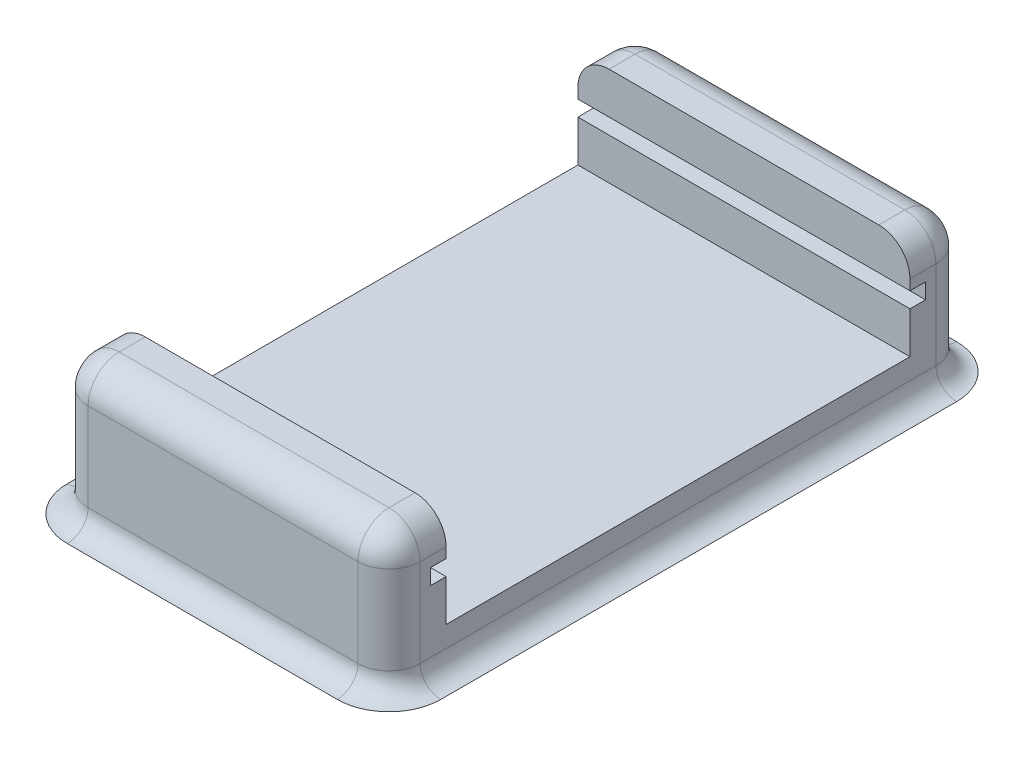
ISO-10303-21;
HEADER;
FILE_DESCRIPTION(('STEP AP214'),'2;1');
FILE_NAME('part.step','',(''),(''),'','','');
FILE_SCHEMA(('AUTOMOTIVE_DESIGN { 1 0 10303 214 1 1 1 1 }'));
ENDSEC;
DATA;
#1=APPLICATION_CONTEXT('core data for automotive mechanical design processes');
#2=APPLICATION_PROTOCOL_DEFINITION('international standard','automotive_design',2000,#1);
#3=PRODUCT_CONTEXT('',#1,'mechanical');
#4=PRODUCT('Part','Part','',(#3));
#5=PRODUCT_RELATED_PRODUCT_CATEGORY('part','',(#4));
#6=PRODUCT_DEFINITION_FORMATION('','',#4);
#7=PRODUCT_DEFINITION_CONTEXT('part definition',#1,'design');
#8=PRODUCT_DEFINITION('design','',#6,#7);
#9=PRODUCT_DEFINITION_SHAPE('','',#8);
#10=(LENGTH_UNIT() NAMED_UNIT(*) SI_UNIT(.MILLI.,.METRE.));
#11=(NAMED_UNIT(*) PLANE_ANGLE_UNIT() SI_UNIT($,.RADIAN.));
#12=(NAMED_UNIT(*) SI_UNIT($,.STERADIAN.) SOLID_ANGLE_UNIT());
#13=UNCERTAINTY_MEASURE_WITH_UNIT(LENGTH_MEASURE(1.E-05),#10,'distance_accuracy_value','');
#14=(GEOMETRIC_REPRESENTATION_CONTEXT(3) GLOBAL_UNCERTAINTY_ASSIGNED_CONTEXT((#13)) GLOBAL_UNIT_ASSIGNED_CONTEXT((#10,
#11,#12)) REPRESENTATION_CONTEXT('',''));
#15=CARTESIAN_POINT('',(0.,0.,0.));
#16=DIRECTION('',(0.,0.,1.));
#17=DIRECTION('',(1.,0.,0.));
#18=AXIS2_PLACEMENT_3D('',#15,#16,#17);
#19=CARTESIAN_POINT('',(24.13,18.0594,0.));
#20=DIRECTION('',(0.,1.,0.));
#21=DIRECTION('',(0.,0.,1.));
#22=AXIS2_PLACEMENT_3D('',#19,#20,#21);
#23=PLANE('',#22);
#24=DIRECTION('',(0.,0.,1.));
#25=VECTOR('',#24,1.);
#26=CARTESIAN_POINT('',(64.77,18.0594,0.));
#27=LINE('',#26,#25);
#28=CARTESIAN_POINT('',(64.77,18.0594,-86.106));
#29=VERTEX_POINT('',#28);
#30=CARTESIAN_POINT('',(64.77,18.0594,-84.201));
#31=VERTEX_POINT('',#30);
#32=EDGE_CURVE('E384',#29,#31,#27,.T.);
#33=ORIENTED_EDGE('',*,*,#32,.T.);
#34=DIRECTION('',(1.,0.,0.));
#35=VECTOR('',#34,1.);
#36=CARTESIAN_POINT('',(24.13,18.0594,-84.201));
#37=LINE('',#36,#35);
#38=CARTESIAN_POINT('',(24.13,18.0594,-84.201));
#39=VERTEX_POINT('',#38);
#40=EDGE_CURVE('E331',#39,#31,#37,.T.);
#41=ORIENTED_EDGE('',*,*,#40,.F.);
#42=DIRECTION('',(0.,0.,1.));
#43=VECTOR('',#42,1.);
#44=CARTESIAN_POINT('',(24.13,18.0594,0.));
#45=LINE('',#44,#43);
#46=CARTESIAN_POINT('',(24.13,18.0594,-86.106));
#47=VERTEX_POINT('',#46);
#48=EDGE_CURVE('E50',#47,#39,#45,.T.);
#49=ORIENTED_EDGE('',*,*,#48,.F.);
#50=DIRECTION('',(1.,0.,0.));
#51=VECTOR('',#50,1.);
#52=CARTESIAN_POINT('',(24.13,18.0594,-86.106));
#53=LINE('',#52,#51);
#54=EDGE_CURVE('E380',#47,#29,#53,.T.);
#55=ORIENTED_EDGE('',*,*,#54,.T.);
#56=EDGE_LOOP('',(#33,#41,#49,#55));
#57=FACE_BOUND('',#56,.T.);
#58=ADVANCED_FACE('F46',(#57),#23,.F.);
#59=CARTESIAN_POINT('',(24.13,0.,-84.201));
#60=DIRECTION('',(0.,0.,1.));
#61=DIRECTION('',(1.,0.,0.));
#62=AXIS2_PLACEMENT_3D('',#59,#60,#61);
#63=PLANE('',#62);
#64=DIRECTION('',(0.,-1.,0.));
#65=VECTOR('',#64,1.);
#66=CARTESIAN_POINT('',(64.77,0.,-84.201));
#67=LINE('',#66,#65);
#68=CARTESIAN_POINT('',(64.77,16.1544,-84.201));
#69=VERTEX_POINT('',#68);
#70=EDGE_CURVE('E336',#31,#69,#67,.T.);
#71=ORIENTED_EDGE('',*,*,#70,.T.);
#72=DIRECTION('',(1.,0.,0.));
#73=VECTOR('',#72,1.);
#74=CARTESIAN_POINT('',(24.13,16.1544,-84.201));
#75=LINE('',#74,#73);
#76=CARTESIAN_POINT('',(24.13,16.1544,-84.201));
#77=VERTEX_POINT('',#76);
#78=EDGE_CURVE('E337',#77,#69,#75,.T.);
#79=ORIENTED_EDGE('',*,*,#78,.F.);
#80=DIRECTION('',(0.,-1.,0.));
#81=VECTOR('',#80,1.);
#82=CARTESIAN_POINT('',(24.13,0.,-84.201));
#83=LINE('',#82,#81);
#84=EDGE_CURVE('E424',#39,#77,#83,.T.);
#85=ORIENTED_EDGE('',*,*,#84,.F.);
#86=ORIENTED_EDGE('',*,*,#40,.T.);
#87=EDGE_LOOP('',(#71,#79,#85,#86));
#88=FACE_BOUND('',#87,.T.);
#89=ADVANCED_FACE('F516',(#88),#63,.F.);
#90=CARTESIAN_POINT('',(24.13,16.1544,0.));
#91=DIRECTION('',(0.,1.,0.));
#92=DIRECTION('',(0.,0.,1.));
#93=AXIS2_PLACEMENT_3D('',#90,#91,#92);
#94=PLANE('',#93);
#95=DIRECTION('',(0.,0.,1.));
#96=VECTOR('',#95,1.);
#97=CARTESIAN_POINT('',(64.77,16.1544,0.));
#98=LINE('',#97,#96);
#99=CARTESIAN_POINT('',(64.77,16.1544,-86.106));
#100=VERTEX_POINT('',#99);
#101=EDGE_CURVE('E266',#100,#69,#98,.T.);
#102=ORIENTED_EDGE('',*,*,#101,.F.);
#103=DIRECTION('',(1.,0.,0.));
#104=VECTOR('',#103,1.);
#105=CARTESIAN_POINT('',(24.13,16.1544,-86.106));
#106=LINE('',#105,#104);
#107=CARTESIAN_POINT('',(24.13,16.1544,-86.106));
#108=VERTEX_POINT('',#107);
#109=EDGE_CURVE('E342',#108,#100,#106,.T.);
#110=ORIENTED_EDGE('',*,*,#109,.F.);
#111=DIRECTION('',(0.,0.,1.));
#112=VECTOR('',#111,1.);
#113=CARTESIAN_POINT('',(24.13,16.1544,0.));
#114=LINE('',#113,#112);
#115=EDGE_CURVE('E335',#108,#77,#114,.T.);
#116=ORIENTED_EDGE('',*,*,#115,.T.);
#117=ORIENTED_EDGE('',*,*,#78,.T.);
#118=EDGE_LOOP('',(#102,#110,#116,#117));
#119=FACE_BOUND('',#118,.T.);
#120=ADVANCED_FACE('F517',(#119),#94,.T.);
#121=CARTESIAN_POINT('',(24.13,0.,-86.106));
#122=DIRECTION('',(0.,0.,1.));
#123=DIRECTION('',(1.,0.,0.));
#124=AXIS2_PLACEMENT_3D('',#121,#122,#123);
#125=PLANE('',#124);
#126=DIRECTION('',(0.,-1.,0.));
#127=VECTOR('',#126,1.);
#128=CARTESIAN_POINT('',(64.77,0.,-86.106));
#129=LINE('',#128,#127);
#130=CARTESIAN_POINT('',(64.77,11.0744,-86.106));
#131=VERTEX_POINT('',#130);
#132=EDGE_CURVE('E341',#100,#131,#129,.T.);
#133=ORIENTED_EDGE('',*,*,#132,.T.);
#134=DIRECTION('',(1.,0.,0.));
#135=VECTOR('',#134,1.);
#136=CARTESIAN_POINT('',(24.13,11.0744,-86.106));
#137=LINE('',#136,#135);
#138=CARTESIAN_POINT('',(24.13,11.0744,-86.106));
#139=VERTEX_POINT('',#138);
#140=EDGE_CURVE('E347',#139,#131,#137,.T.);
#141=ORIENTED_EDGE('',*,*,#140,.F.);
#142=DIRECTION('',(0.,-1.,0.));
#143=VECTOR('',#142,1.);
#144=CARTESIAN_POINT('',(24.13,0.,-86.106));
#145=LINE('',#144,#143);
#146=EDGE_CURVE('E420',#108,#139,#145,.T.);
#147=ORIENTED_EDGE('',*,*,#146,.F.);
#148=ORIENTED_EDGE('',*,*,#109,.T.);
#149=EDGE_LOOP('',(#133,#141,#147,#148));
#150=FACE_BOUND('',#149,.T.);
#151=ADVANCED_FACE('F522',(#150),#125,.F.);
#152=CARTESIAN_POINT('',(24.13,11.0744,0.));
#153=DIRECTION('',(0.,1.,0.));
#154=DIRECTION('',(0.,0.,1.));
#155=AXIS2_PLACEMENT_3D('',#152,#153,#154);
#156=PLANE('',#155);
#157=DIRECTION('',(0.,0.,1.));
#158=VECTOR('',#157,1.);
#159=CARTESIAN_POINT('',(64.77,11.0744,0.));
#160=LINE('',#159,#158);
#161=CARTESIAN_POINT('',(64.77,11.0744,-142.875));
#162=VERTEX_POINT('',#161);
#163=EDGE_CURVE('E394',#162,#131,#160,.T.);
#164=ORIENTED_EDGE('',*,*,#163,.F.);
#165=DIRECTION('',(1.,0.,0.));
#166=VECTOR('',#165,1.);
#167=CARTESIAN_POINT('',(24.13,11.0744,-142.875));
#168=LINE('',#167,#166);
#169=CARTESIAN_POINT('',(24.13,11.0744,-142.875));
#170=VERTEX_POINT('',#169);
#171=EDGE_CURVE('E352',#170,#162,#168,.T.);
#172=ORIENTED_EDGE('',*,*,#171,.F.);
#173=DIRECTION('',(0.,0.,1.));
#174=VECTOR('',#173,1.);
#175=CARTESIAN_POINT('',(24.13,11.0744,0.));
#176=LINE('',#175,#174);
#177=EDGE_CURVE('E346',#170,#139,#176,.T.);
#178=ORIENTED_EDGE('',*,*,#177,.T.);
#179=ORIENTED_EDGE('',*,*,#140,.T.);
#180=EDGE_LOOP('',(#164,#172,#178,#179));
#181=FACE_BOUND('',#180,.T.);
#182=ADVANCED_FACE('F526',(#181),#156,.T.);
#183=CARTESIAN_POINT('',(24.13,0.,-142.875));
#184=DIRECTION('',(0.,0.,1.));
#185=DIRECTION('',(1.,0.,0.));
#186=AXIS2_PLACEMENT_3D('',#183,#184,#185);
#187=PLANE('',#186);
#188=DIRECTION('',(0.,-1.,0.));
#189=VECTOR('',#188,1.);
#190=CARTESIAN_POINT('',(64.77,0.,-142.875));
#191=LINE('',#190,#189);
#192=CARTESIAN_POINT('',(64.77,16.1544,-142.875));
#193=VERTEX_POINT('',#192);
#194=EDGE_CURVE('E390',#193,#162,#191,.T.);
#195=ORIENTED_EDGE('',*,*,#194,.F.);
#196=DIRECTION('',(1.,0.,0.));
#197=VECTOR('',#196,1.);
#198=CARTESIAN_POINT('',(24.13,16.1544,-142.875));
#199=LINE('',#198,#197);
#200=CARTESIAN_POINT('',(24.13,16.1544,-142.875));
#201=VERTEX_POINT('',#200);
#202=EDGE_CURVE('E357',#201,#193,#199,.T.);
#203=ORIENTED_EDGE('',*,*,#202,.F.);
#204=DIRECTION('',(0.,-1.,0.));
#205=VECTOR('',#204,1.);
#206=CARTESIAN_POINT('',(24.13,0.,-142.875));
#207=LINE('',#206,#205);
#208=EDGE_CURVE('E351',#201,#170,#207,.T.);
#209=ORIENTED_EDGE('',*,*,#208,.T.);
#210=ORIENTED_EDGE('',*,*,#171,.T.);
#211=EDGE_LOOP('',(#195,#203,#209,#210));
#212=FACE_BOUND('',#211,.T.);
#213=ADVANCED_FACE('F529',(#212),#187,.T.);
#214=CARTESIAN_POINT('',(64.77,16.1544,-144.78));
#215=VERTEX_POINT('',#214);
#216=EDGE_CURVE('E389',#215,#193,#98,.T.);
#217=ORIENTED_EDGE('',*,*,#216,.F.);
#218=DIRECTION('',(1.,0.,0.));
#219=VECTOR('',#218,1.);
#220=CARTESIAN_POINT('',(24.13,16.1544,-144.78));
#221=LINE('',#220,#219);
#222=CARTESIAN_POINT('',(24.13,16.1544,-144.78));
#223=VERTEX_POINT('',#222);
#224=EDGE_CURVE('E362',#223,#215,#221,.T.);
#225=ORIENTED_EDGE('',*,*,#224,.F.);
#226=EDGE_CURVE('E356',#223,#201,#114,.T.);
#227=ORIENTED_EDGE('',*,*,#226,.T.);
#228=ORIENTED_EDGE('',*,*,#202,.T.);
#229=EDGE_LOOP('',(#217,#225,#227,#228));
#230=FACE_BOUND('',#229,.T.);
#231=ADVANCED_FACE('F534',(#230),#94,.T.);
#232=CARTESIAN_POINT('',(24.13,0.,-144.78));
#233=DIRECTION('',(0.,0.,1.));
#234=DIRECTION('',(1.,0.,0.));
#235=AXIS2_PLACEMENT_3D('',#232,#233,#234);
#236=PLANE('',#235);
#237=DIRECTION('',(0.,-1.,0.));
#238=VECTOR('',#237,1.);
#239=CARTESIAN_POINT('',(64.77,0.,-144.78));
#240=LINE('',#239,#238);
#241=CARTESIAN_POINT('',(64.77,18.0594,-144.78));
#242=VERTEX_POINT('',#241);
#243=EDGE_CURVE('E385',#242,#215,#240,.T.);
#244=ORIENTED_EDGE('',*,*,#243,.F.);
#245=DIRECTION('',(1.,0.,0.));
#246=VECTOR('',#245,1.);
#247=CARTESIAN_POINT('',(24.13,18.0594,-144.78));
#248=LINE('',#247,#246);
#249=CARTESIAN_POINT('',(24.13,18.0594,-144.78));
#250=VERTEX_POINT('',#249);
#251=EDGE_CURVE('E256',#250,#242,#248,.T.);
#252=ORIENTED_EDGE('',*,*,#251,.F.);
#253=DIRECTION('',(0.,-1.,0.));
#254=VECTOR('',#253,1.);
#255=CARTESIAN_POINT('',(24.13,0.,-144.78));
#256=LINE('',#255,#254);
#257=EDGE_CURVE('E361',#250,#223,#256,.T.);
#258=ORIENTED_EDGE('',*,*,#257,.T.);
#259=ORIENTED_EDGE('',*,*,#224,.T.);
#260=EDGE_LOOP('',(#244,#252,#258,#259));
#261=FACE_BOUND('',#260,.T.);
#262=ADVANCED_FACE('F562',(#261),#236,.T.);
#263=CARTESIAN_POINT('',(64.77,18.0594,-142.875));
#264=VERTEX_POINT('',#263);
#265=EDGE_CURVE('E366',#242,#264,#27,.T.);
#266=ORIENTED_EDGE('',*,*,#265,.T.);
#267=DIRECTION('',(1.,0.,0.));
#268=VECTOR('',#267,1.);
#269=CARTESIAN_POINT('',(24.13,18.0594,-142.875));
#270=LINE('',#269,#268);
#271=CARTESIAN_POINT('',(24.13,18.0594,-142.875));
#272=VERTEX_POINT('',#271);
#273=EDGE_CURVE('E370',#272,#264,#270,.T.);
#274=ORIENTED_EDGE('',*,*,#273,.F.);
#275=EDGE_CURVE('E307',#250,#272,#45,.T.);
#276=ORIENTED_EDGE('',*,*,#275,.F.);
#277=ORIENTED_EDGE('',*,*,#251,.T.);
#278=EDGE_LOOP('',(#266,#274,#276,#277));
#279=FACE_BOUND('',#278,.T.);
#280=ADVANCED_FACE('F457',(#279),#23,.F.);
#281=CARTESIAN_POINT('',(64.77,19.3294,-142.875));
#282=VERTEX_POINT('',#281);
#283=EDGE_CURVE('E275',#282,#264,#191,.T.);
#284=ORIENTED_EDGE('',*,*,#283,.F.);
#285=CARTESIAN_POINT('',(60.96,19.3294,-142.875));
#286=DIRECTION('',(0.,0.,1.));
#287=DIRECTION('',(1.,0.,0.));
#288=AXIS2_PLACEMENT_3D('',#285,#286,#287);
#289=CIRCLE('',#288,3.81);
#290=CARTESIAN_POINT('',(60.96,23.1394,-142.875));
#291=VERTEX_POINT('',#290);
#292=EDGE_CURVE('E251',#282,#291,#289,.T.);
#293=ORIENTED_EDGE('',*,*,#292,.T.);
#294=DIRECTION('',(1.,0.,0.));
#295=VECTOR('',#294,1.);
#296=CARTESIAN_POINT('',(24.13,23.1394,-142.875));
#297=LINE('',#296,#295);
#298=CARTESIAN_POINT('',(27.94,23.1394,-142.875));
#299=VERTEX_POINT('',#298);
#300=EDGE_CURVE('E247',#299,#291,#297,.T.);
#301=ORIENTED_EDGE('',*,*,#300,.F.);
#302=CARTESIAN_POINT('',(27.94,19.3294,-142.875));
#303=DIRECTION('',(0.,0.,1.));
#304=DIRECTION('',(1.,0.,0.));
#305=AXIS2_PLACEMENT_3D('',#302,#303,#304);
#306=CIRCLE('',#305,3.81);
#307=CARTESIAN_POINT('',(24.13,19.3294,-142.875));
#308=VERTEX_POINT('',#307);
#309=EDGE_CURVE('E255',#299,#308,#306,.T.);
#310=ORIENTED_EDGE('',*,*,#309,.T.);
#311=EDGE_CURVE('E260',#308,#272,#207,.T.);
#312=ORIENTED_EDGE('',*,*,#311,.T.);
#313=ORIENTED_EDGE('',*,*,#273,.T.);
#314=EDGE_LOOP('',(#284,#293,#301,#310,#312,#313));
#315=FACE_BOUND('',#314,.T.);
#316=ADVANCED_FACE('F462',(#315),#187,.T.);
#317=CARTESIAN_POINT('',(24.13,23.1394,0.));
#318=DIRECTION('',(0.,1.,0.));
#319=DIRECTION('',(0.,0.,1.));
#320=AXIS2_PLACEMENT_3D('',#317,#318,#319);
#321=PLANE('',#320);
#322=ORIENTED_EDGE('',*,*,#300,.T.);
#323=DIRECTION('',(0.,0.,1.));
#324=VECTOR('',#323,1.);
#325=CARTESIAN_POINT('',(60.96,23.1394,-146.05));
#326=LINE('',#325,#324);
#327=CARTESIAN_POINT('',(60.96,23.1394,-146.05));
#328=VERTEX_POINT('',#327);
#329=EDGE_CURVE('E242',#291,#328,#326,.F.);
#330=ORIENTED_EDGE('',*,*,#329,.T.);
#331=DIRECTION('',(1.,0.,0.));
#332=VECTOR('',#331,1.);
#333=CARTESIAN_POINT('',(24.13,23.1394,-146.05));
#334=LINE('',#333,#332);
#335=CARTESIAN_POINT('',(27.94,23.1394,-146.05));
#336=VERTEX_POINT('',#335);
#337=EDGE_CURVE('E246',#328,#336,#334,.F.);
#338=ORIENTED_EDGE('',*,*,#337,.T.);
#339=DIRECTION('',(0.,0.,1.));
#340=VECTOR('',#339,1.);
#341=CARTESIAN_POINT('',(27.94,23.1394,0.));
#342=LINE('',#341,#340);
#343=EDGE_CURVE('E222',#336,#299,#342,.T.);
#344=ORIENTED_EDGE('',*,*,#343,.T.);
#345=EDGE_LOOP('',(#322,#330,#338,#344));
#346=FACE_BOUND('',#345,.T.);
#347=ADVANCED_FACE('F580',(#346),#321,.T.);
#348=CARTESIAN_POINT('',(24.13,0.,-149.86));
#349=DIRECTION('',(0.,0.,-1.));
#350=DIRECTION('',(-1.,0.,0.));
#351=AXIS2_PLACEMENT_3D('',#348,#349,#350);
#352=PLANE('',#351);
#353=DIRECTION('',(0.,1.,0.));
#354=VECTOR('',#353,1.);
#355=CARTESIAN_POINT('',(60.96,5.9944,-149.86));
#356=LINE('',#355,#354);
#357=CARTESIAN_POINT('',(60.96,19.3294,-149.86));
#358=VERTEX_POINT('',#357);
#359=CARTESIAN_POINT('',(60.96,8.5344,-149.86));
#360=VERTEX_POINT('',#359);
#361=EDGE_CURVE('E148',#358,#360,#356,.F.);
#362=ORIENTED_EDGE('',*,*,#361,.T.);
#363=DIRECTION('',(1.,0.,0.));
#364=VECTOR('',#363,1.);
#365=CARTESIAN_POINT('',(24.13,8.5344,-149.86));
#366=LINE('',#365,#364);
#367=CARTESIAN_POINT('',(27.94,8.5344,-149.86));
#368=VERTEX_POINT('',#367);
#369=EDGE_CURVE('E143',#360,#368,#366,.F.);
#370=ORIENTED_EDGE('',*,*,#369,.T.);
#371=DIRECTION('',(0.,1.,0.));
#372=VECTOR('',#371,1.);
#373=CARTESIAN_POINT('',(27.94,0.,-149.86));
#374=LINE('',#373,#372);
#375=CARTESIAN_POINT('',(27.94,19.3294,-149.86));
#376=VERTEX_POINT('',#375);
#377=EDGE_CURVE('E147',#368,#376,#374,.T.);
#378=ORIENTED_EDGE('',*,*,#377,.T.);
#379=DIRECTION('',(1.,0.,0.));
#380=VECTOR('',#379,1.);
#381=CARTESIAN_POINT('',(24.13,19.3294,-149.86));
#382=LINE('',#381,#380);
#383=EDGE_CURVE('E226',#376,#358,#382,.T.);
#384=ORIENTED_EDGE('',*,*,#383,.T.);
#385=EDGE_LOOP('',(#362,#370,#378,#384));
#386=FACE_BOUND('',#385,.T.);
#387=ADVANCED_FACE('F581',(#386),#352,.T.);
#388=CARTESIAN_POINT('',(24.13,0.,-79.121));
#389=DIRECTION('',(0.,0.,-1.));
#390=DIRECTION('',(-1.,0.,0.));
#391=AXIS2_PLACEMENT_3D('',#388,#389,#390);
#392=PLANE('',#391);
#393=DIRECTION('',(0.,1.,0.));
#394=VECTOR('',#393,1.);
#395=CARTESIAN_POINT('',(27.94,5.9944,-79.121));
#396=LINE('',#395,#394);
#397=CARTESIAN_POINT('',(27.94,19.3294,-79.121));
#398=VERTEX_POINT('',#397);
#399=CARTESIAN_POINT('',(27.94,8.5344,-79.121));
#400=VERTEX_POINT('',#399);
#401=EDGE_CURVE('E172',#398,#400,#396,.F.);
#402=ORIENTED_EDGE('',*,*,#401,.T.);
#403=DIRECTION('',(1.,0.,0.));
#404=VECTOR('',#403,1.);
#405=CARTESIAN_POINT('',(60.96,8.5344,-79.121));
#406=LINE('',#405,#404);
#407=CARTESIAN_POINT('',(60.96,8.5344,-79.121));
#408=VERTEX_POINT('',#407);
#409=EDGE_CURVE('E167',#400,#408,#406,.T.);
#410=ORIENTED_EDGE('',*,*,#409,.T.);
#411=DIRECTION('',(0.,1.,0.));
#412=VECTOR('',#411,1.);
#413=CARTESIAN_POINT('',(60.96,0.,-79.121));
#414=LINE('',#413,#412);
#415=CARTESIAN_POINT('',(60.96,19.3294,-79.121));
#416=VERTEX_POINT('',#415);
#417=EDGE_CURVE('E171',#408,#416,#414,.T.);
#418=ORIENTED_EDGE('',*,*,#417,.T.);
#419=DIRECTION('',(1.,0.,0.));
#420=VECTOR('',#419,1.);
#421=CARTESIAN_POINT('',(24.13,19.3294,-79.121));
#422=LINE('',#421,#420);
#423=EDGE_CURVE('E233',#416,#398,#422,.F.);
#424=ORIENTED_EDGE('',*,*,#423,.T.);
#425=EDGE_LOOP('',(#402,#410,#418,#424));
#426=FACE_BOUND('',#425,.T.);
#427=ADVANCED_FACE('F584',(#426),#392,.F.);
#428=DIRECTION('',(1.,0.,0.));
#429=VECTOR('',#428,1.);
#430=CARTESIAN_POINT('',(24.13,23.1394,-86.106));
#431=LINE('',#430,#429);
#432=CARTESIAN_POINT('',(27.94,23.1394,-86.106));
#433=VERTEX_POINT('',#432);
#434=CARTESIAN_POINT('',(60.96,23.1394,-86.106));
#435=VERTEX_POINT('',#434);
#436=EDGE_CURVE('E289',#433,#435,#431,.T.);
#437=ORIENTED_EDGE('',*,*,#436,.F.);
#438=DIRECTION('',(0.,0.,1.));
#439=VECTOR('',#438,1.);
#440=CARTESIAN_POINT('',(27.94,23.1394,0.));
#441=LINE('',#440,#439);
#442=CARTESIAN_POINT('',(27.94,23.1394,-82.931));
#443=VERTEX_POINT('',#442);
#444=EDGE_CURVE('E311',#433,#443,#441,.T.);
#445=ORIENTED_EDGE('',*,*,#444,.T.);
#446=DIRECTION('',(1.,0.,0.));
#447=VECTOR('',#446,1.);
#448=CARTESIAN_POINT('',(64.77,23.1394,-82.931));
#449=LINE('',#448,#447);
#450=CARTESIAN_POINT('',(60.96,23.1394,-82.931));
#451=VERTEX_POINT('',#450);
#452=EDGE_CURVE('E315',#443,#451,#449,.T.);
#453=ORIENTED_EDGE('',*,*,#452,.T.);
#454=DIRECTION('',(0.,0.,1.));
#455=VECTOR('',#454,1.);
#456=CARTESIAN_POINT('',(60.96,23.1394,-86.106));
#457=LINE('',#456,#455);
#458=EDGE_CURVE('E290',#451,#435,#457,.F.);
#459=ORIENTED_EDGE('',*,*,#458,.T.);
#460=EDGE_LOOP('',(#437,#445,#453,#459));
#461=FACE_BOUND('',#460,.T.);
#462=ADVANCED_FACE('F588',(#461),#321,.T.);
#463=CARTESIAN_POINT('',(24.13,19.3294,-86.106));
#464=VERTEX_POINT('',#463);
#465=EDGE_CURVE('E300',#464,#47,#145,.T.);
#466=ORIENTED_EDGE('',*,*,#465,.F.);
#467=CARTESIAN_POINT('',(27.94,19.3294,-86.106));
#468=DIRECTION('',(0.,0.,1.));
#469=DIRECTION('',(1.,0.,0.));
#470=AXIS2_PLACEMENT_3D('',#467,#468,#469);
#471=CIRCLE('',#470,3.81);
#472=EDGE_CURVE('E285',#464,#433,#471,.F.);
#473=ORIENTED_EDGE('',*,*,#472,.T.);
#474=ORIENTED_EDGE('',*,*,#436,.T.);
#475=CARTESIAN_POINT('',(60.96,19.3294,-86.106));
#476=DIRECTION('',(0.,0.,1.));
#477=DIRECTION('',(1.,0.,0.));
#478=AXIS2_PLACEMENT_3D('',#475,#476,#477);
#479=CIRCLE('',#478,3.81);
#480=CARTESIAN_POINT('',(64.77,19.3294,-86.106));
#481=VERTEX_POINT('',#480);
#482=EDGE_CURVE('E291',#435,#481,#479,.F.);
#483=ORIENTED_EDGE('',*,*,#482,.T.);
#484=EDGE_CURVE('E295',#481,#29,#129,.T.);
#485=ORIENTED_EDGE('',*,*,#484,.T.);
#486=ORIENTED_EDGE('',*,*,#54,.F.);
#487=EDGE_LOOP('',(#466,#473,#474,#483,#485,#486));
#488=FACE_BOUND('',#487,.T.);
#489=ADVANCED_FACE('F592',(#488),#125,.F.);
#490=CARTESIAN_POINT('',(24.13,0.,0.));
#491=DIRECTION('',(-1.,0.,0.));
#492=DIRECTION('',(0.,0.,1.));
#493=AXIS2_PLACEMENT_3D('',#490,#491,#492);
#494=PLANE('',#493);
#495=DIRECTION('',(0.,1.,0.));
#496=VECTOR('',#495,1.);
#497=CARTESIAN_POINT('',(24.13,0.,-146.05));
#498=LINE('',#497,#496);
#499=CARTESIAN_POINT('',(24.13,19.3294,-146.05));
#500=VERTEX_POINT('',#499);
#501=CARTESIAN_POINT('',(24.13,8.5344,-146.05));
#502=VERTEX_POINT('',#501);
#503=EDGE_CURVE('E138',#500,#502,#498,.F.);
#504=ORIENTED_EDGE('',*,*,#503,.T.);
#505=DIRECTION('',(0.,0.,-1.));
#506=VECTOR('',#505,1.);
#507=CARTESIAN_POINT('',(24.13,8.5344,0.));
#508=LINE('',#507,#506);
#509=CARTESIAN_POINT('',(24.13,8.5344,-82.931));
#510=VERTEX_POINT('',#509);
#511=EDGE_CURVE('E133',#502,#510,#508,.F.);
#512=ORIENTED_EDGE('',*,*,#511,.T.);
#513=DIRECTION('',(0.,1.,0.));
#514=VECTOR('',#513,1.);
#515=CARTESIAN_POINT('',(24.13,19.3294,-82.931));
#516=LINE('',#515,#514);
#517=CARTESIAN_POINT('',(24.13,19.3294,-82.931));
#518=VERTEX_POINT('',#517);
#519=EDGE_CURVE('E137',#510,#518,#516,.T.);
#520=ORIENTED_EDGE('',*,*,#519,.T.);
#521=DIRECTION('',(0.,0.,1.));
#522=VECTOR('',#521,1.);
#523=CARTESIAN_POINT('',(24.13,19.3294,0.));
#524=LINE('',#523,#522);
#525=EDGE_CURVE('E296',#518,#464,#524,.F.);
#526=ORIENTED_EDGE('',*,*,#525,.T.);
#527=ORIENTED_EDGE('',*,*,#465,.T.);
#528=ORIENTED_EDGE('',*,*,#48,.T.);
#529=ORIENTED_EDGE('',*,*,#84,.T.);
#530=ORIENTED_EDGE('',*,*,#115,.F.);
#531=ORIENTED_EDGE('',*,*,#146,.T.);
#532=ORIENTED_EDGE('',*,*,#177,.F.);
#533=ORIENTED_EDGE('',*,*,#208,.F.);
#534=ORIENTED_EDGE('',*,*,#226,.F.);
#535=ORIENTED_EDGE('',*,*,#257,.F.);
#536=ORIENTED_EDGE('',*,*,#275,.T.);
#537=ORIENTED_EDGE('',*,*,#311,.F.);
#538=DIRECTION('',(0.,0.,1.));
#539=VECTOR('',#538,1.);
#540=CARTESIAN_POINT('',(24.13,19.3294,0.));
#541=LINE('',#540,#539);
#542=EDGE_CURVE('E270',#308,#500,#541,.F.);
#543=ORIENTED_EDGE('',*,*,#542,.T.);
#544=EDGE_LOOP('',(#504,#512,#520,#526,#527,#528,#529,#530,#531,#532,#533,#534,#535,#536,#537,#543));
#545=FACE_BOUND('',#544,.T.);
#546=ADVANCED_FACE('F447',(#545),#494,.T.);
#547=CARTESIAN_POINT('',(64.77,0.,0.));
#548=DIRECTION('',(-1.,0.,0.));
#549=DIRECTION('',(0.,0.,1.));
#550=AXIS2_PLACEMENT_3D('',#547,#548,#549);
#551=PLANE('',#550);
#552=DIRECTION('',(0.,1.,0.));
#553=VECTOR('',#552,1.);
#554=CARTESIAN_POINT('',(64.77,0.,-82.931));
#555=LINE('',#554,#553);
#556=CARTESIAN_POINT('',(64.77,19.3294,-82.931));
#557=VERTEX_POINT('',#556);
#558=CARTESIAN_POINT('',(64.77,8.5344,-82.931));
#559=VERTEX_POINT('',#558);
#560=EDGE_CURVE('E160',#557,#559,#555,.F.);
#561=ORIENTED_EDGE('',*,*,#560,.T.);
#562=DIRECTION('',(0.,0.,-1.));
#563=VECTOR('',#562,1.);
#564=CARTESIAN_POINT('',(64.77,8.5344,-146.05));
#565=LINE('',#564,#563);
#566=CARTESIAN_POINT('',(64.77,8.5344,-146.05));
#567=VERTEX_POINT('',#566);
#568=EDGE_CURVE('E155',#559,#567,#565,.T.);
#569=ORIENTED_EDGE('',*,*,#568,.T.);
#570=DIRECTION('',(0.,1.,0.));
#571=VECTOR('',#570,1.);
#572=CARTESIAN_POINT('',(64.77,19.3294,-146.05));
#573=LINE('',#572,#571);
#574=CARTESIAN_POINT('',(64.77,19.3294,-146.05));
#575=VERTEX_POINT('',#574);
#576=EDGE_CURVE('E159',#567,#575,#573,.T.);
#577=ORIENTED_EDGE('',*,*,#576,.T.);
#578=DIRECTION('',(0.,0.,1.));
#579=VECTOR('',#578,1.);
#580=CARTESIAN_POINT('',(64.77,19.3294,-142.875));
#581=LINE('',#580,#579);
#582=EDGE_CURVE('E271',#575,#282,#581,.T.);
#583=ORIENTED_EDGE('',*,*,#582,.T.);
#584=ORIENTED_EDGE('',*,*,#283,.T.);
#585=ORIENTED_EDGE('',*,*,#265,.F.);
#586=ORIENTED_EDGE('',*,*,#243,.T.);
#587=ORIENTED_EDGE('',*,*,#216,.T.);
#588=ORIENTED_EDGE('',*,*,#194,.T.);
#589=ORIENTED_EDGE('',*,*,#163,.T.);
#590=ORIENTED_EDGE('',*,*,#132,.F.);
#591=ORIENTED_EDGE('',*,*,#101,.T.);
#592=ORIENTED_EDGE('',*,*,#70,.F.);
#593=ORIENTED_EDGE('',*,*,#32,.F.);
#594=ORIENTED_EDGE('',*,*,#484,.F.);
#595=DIRECTION('',(0.,0.,1.));
#596=VECTOR('',#595,1.);
#597=CARTESIAN_POINT('',(64.77,19.3294,-82.931));
#598=LINE('',#597,#596);
#599=EDGE_CURVE('E261',#481,#557,#598,.T.);
#600=ORIENTED_EDGE('',*,*,#599,.T.);
#601=EDGE_LOOP('',(#561,#569,#577,#583,#584,#585,#586,#587,#588,#589,#590,#591,#592,#593,#594,#600));
#602=FACE_BOUND('',#601,.T.);
#603=ADVANCED_FACE('F559',(#602),#551,.F.);
#604=CARTESIAN_POINT('',(24.13,19.3294,-82.931));
#605=DIRECTION('',(-1.,0.,0.));
#606=DIRECTION('',(0.,0.,1.));
#607=AXIS2_PLACEMENT_3D('',#604,#605,#606);
#608=CYLINDRICAL_SURFACE('',#607,3.81);
#609=ORIENTED_EDGE('',*,*,#452,.F.);
#610=CARTESIAN_POINT('',(27.94,19.3294,-82.931));
#611=DIRECTION('',(-1.,0.,0.));
#612=DIRECTION('',(0.,0.,1.));
#613=AXIS2_PLACEMENT_3D('',#610,#611,#612);
#614=CIRCLE('',#613,3.81);
#615=EDGE_CURVE('E265',#443,#398,#614,.F.);
#616=ORIENTED_EDGE('',*,*,#615,.T.);
#617=ORIENTED_EDGE('',*,*,#423,.F.);
#618=CARTESIAN_POINT('',(60.96,19.3294,-82.931));
#619=DIRECTION('',(-1.,0.,0.));
#620=DIRECTION('',(0.,0.,1.));
#621=AXIS2_PLACEMENT_3D('',#618,#619,#620);
#622=CIRCLE('',#621,3.81);
#623=EDGE_CURVE('E238',#416,#451,#622,.T.);
#624=ORIENTED_EDGE('',*,*,#623,.T.);
#625=EDGE_LOOP('',(#609,#616,#617,#624));
#626=FACE_BOUND('',#625,.T.);
#627=ADVANCED_FACE('F598',(#626),#608,.T.);
#628=CARTESIAN_POINT('',(24.13,19.3294,-146.05));
#629=DIRECTION('',(1.,0.,0.));
#630=DIRECTION('',(0.,0.,-1.));
#631=AXIS2_PLACEMENT_3D('',#628,#629,#630);
#632=CYLINDRICAL_SURFACE('',#631,3.81);
#633=ORIENTED_EDGE('',*,*,#337,.F.);
#634=CARTESIAN_POINT('',(60.96,19.3294,-146.05));
#635=DIRECTION('',(1.,0.,0.));
#636=DIRECTION('',(0.,0.,-1.));
#637=AXIS2_PLACEMENT_3D('',#634,#635,#636);
#638=CIRCLE('',#637,3.81);
#639=EDGE_CURVE('E234',#328,#358,#638,.F.);
#640=ORIENTED_EDGE('',*,*,#639,.T.);
#641=ORIENTED_EDGE('',*,*,#383,.F.);
#642=CARTESIAN_POINT('',(27.94,19.3294,-146.05));
#643=DIRECTION('',(1.,0.,0.));
#644=DIRECTION('',(0.,0.,-1.));
#645=AXIS2_PLACEMENT_3D('',#642,#643,#644);
#646=CIRCLE('',#645,3.81);
#647=EDGE_CURVE('E177',#376,#336,#646,.T.);
#648=ORIENTED_EDGE('',*,*,#647,.T.);
#649=EDGE_LOOP('',(#633,#640,#641,#648));
#650=FACE_BOUND('',#649,.T.);
#651=ADVANCED_FACE('F614',(#650),#632,.T.);
#652=CARTESIAN_POINT('',(27.94,0.,-82.931));
#653=DIRECTION('',(0.,-1.,0.));
#654=DIRECTION('',(1.,0.,0.));
#655=AXIS2_PLACEMENT_3D('',#652,#653,#654);
#656=CYLINDRICAL_SURFACE('',#655,3.81);
#657=ORIENTED_EDGE('',*,*,#519,.F.);
#658=CARTESIAN_POINT('',(27.94,8.5344,-82.931));
#659=DIRECTION('',(0.,-1.,0.));
#660=DIRECTION('',(0.,0.,-1.));
#661=AXIS2_PLACEMENT_3D('',#658,#659,#660);
#662=CIRCLE('',#661,3.81);
#663=EDGE_CURVE('E173',#510,#400,#662,.F.);
#664=ORIENTED_EDGE('',*,*,#663,.T.);
#665=ORIENTED_EDGE('',*,*,#401,.F.);
#666=CARTESIAN_POINT('',(27.94,19.3294,-82.931));
#667=DIRECTION('',(0.,1.,0.));
#668=DIRECTION('',(0.,0.,1.));
#669=AXIS2_PLACEMENT_3D('',#666,#667,#668);
#670=CIRCLE('',#669,3.81);
#671=EDGE_CURVE('E176',#518,#398,#670,.T.);
#672=ORIENTED_EDGE('',*,*,#671,.F.);
#673=EDGE_LOOP('',(#657,#664,#665,#672));
#674=FACE_BOUND('',#673,.T.);
#675=ADVANCED_FACE('F622',(#674),#656,.T.);
#676=CARTESIAN_POINT('',(27.94,19.3294,-82.931));
#677=DIRECTION('',(-1.,0.,0.));
#678=DIRECTION('',(0.,0.,1.));
#679=AXIS2_PLACEMENT_3D('',#676,#677,#678);
#680=SPHERICAL_SURFACE('',#679,3.81);
#681=ORIENTED_EDGE('',*,*,#671,.T.);
#682=ORIENTED_EDGE('',*,*,#615,.F.);
#683=CARTESIAN_POINT('',(27.94,19.3294,-82.931));
#684=DIRECTION('',(0.,0.,-1.));
#685=DIRECTION('',(-1.,0.,0.));
#686=AXIS2_PLACEMENT_3D('',#683,#684,#685);
#687=CIRCLE('',#686,3.81);
#688=EDGE_CURVE('E166',#518,#443,#687,.T.);
#689=ORIENTED_EDGE('',*,*,#688,.F.);
#690=EDGE_LOOP('',(#681,#682,#689));
#691=FACE_BOUND('',#690,.T.);
#692=ADVANCED_FACE('F630',(#691),#680,.T.);
#693=CARTESIAN_POINT('',(27.94,19.3294,0.));
#694=DIRECTION('',(0.,0.,1.));
#695=DIRECTION('',(1.,0.,0.));
#696=AXIS2_PLACEMENT_3D('',#693,#694,#695);
#697=CYLINDRICAL_SURFACE('',#696,3.81);
#698=ORIENTED_EDGE('',*,*,#472,.F.);
#699=ORIENTED_EDGE('',*,*,#525,.F.);
#700=ORIENTED_EDGE('',*,*,#688,.T.);
#701=ORIENTED_EDGE('',*,*,#444,.F.);
#702=EDGE_LOOP('',(#698,#699,#700,#701));
#703=FACE_BOUND('',#702,.T.);
#704=ADVANCED_FACE('F638',(#703),#697,.T.);
#705=CARTESIAN_POINT('',(60.96,0.,-82.931));
#706=DIRECTION('',(0.,1.,0.));
#707=DIRECTION('',(-1.,0.,0.));
#708=AXIS2_PLACEMENT_3D('',#705,#706,#707);
#709=CYLINDRICAL_SURFACE('',#708,3.81);
#710=ORIENTED_EDGE('',*,*,#417,.F.);
#711=CARTESIAN_POINT('',(60.96,8.5344,-82.931));
#712=DIRECTION('',(0.,-1.,0.));
#713=DIRECTION('',(0.,0.,-1.));
#714=AXIS2_PLACEMENT_3D('',#711,#712,#713);
#715=CIRCLE('',#714,3.81);
#716=EDGE_CURVE('E161',#408,#559,#715,.F.);
#717=ORIENTED_EDGE('',*,*,#716,.T.);
#718=ORIENTED_EDGE('',*,*,#560,.F.);
#719=CARTESIAN_POINT('',(60.96,19.3294,-82.931));
#720=DIRECTION('',(0.,1.,0.));
#721=DIRECTION('',(0.,0.,1.));
#722=AXIS2_PLACEMENT_3D('',#719,#720,#721);
#723=CIRCLE('',#722,3.81);
#724=EDGE_CURVE('E165',#416,#557,#723,.T.);
#725=ORIENTED_EDGE('',*,*,#724,.F.);
#726=EDGE_LOOP('',(#710,#717,#718,#725));
#727=FACE_BOUND('',#726,.T.);
#728=ADVANCED_FACE('F646',(#727),#709,.T.);
#729=CARTESIAN_POINT('',(60.96,19.3294,-82.931));
#730=DIRECTION('',(-1.,0.,0.));
#731=DIRECTION('',(0.,0.,1.));
#732=AXIS2_PLACEMENT_3D('',#729,#730,#731);
#733=SPHERICAL_SURFACE('',#732,3.81);
#734=ORIENTED_EDGE('',*,*,#623,.F.);
#735=ORIENTED_EDGE('',*,*,#724,.T.);
#736=CARTESIAN_POINT('',(60.96,19.3294,-82.931));
#737=DIRECTION('',(0.,0.,-1.));
#738=DIRECTION('',(-1.,0.,0.));
#739=AXIS2_PLACEMENT_3D('',#736,#737,#738);
#740=CIRCLE('',#739,3.81);
#741=EDGE_CURVE('E154',#451,#557,#740,.T.);
#742=ORIENTED_EDGE('',*,*,#741,.F.);
#743=EDGE_LOOP('',(#734,#735,#742));
#744=FACE_BOUND('',#743,.T.);
#745=ADVANCED_FACE('F654',(#744),#733,.T.);
#746=CARTESIAN_POINT('',(60.96,19.3294,0.));
#747=DIRECTION('',(0.,0.,-1.));
#748=DIRECTION('',(-1.,0.,0.));
#749=AXIS2_PLACEMENT_3D('',#746,#747,#748);
#750=CYLINDRICAL_SURFACE('',#749,3.81);
#751=ORIENTED_EDGE('',*,*,#482,.F.);
#752=ORIENTED_EDGE('',*,*,#458,.F.);
#753=ORIENTED_EDGE('',*,*,#741,.T.);
#754=ORIENTED_EDGE('',*,*,#599,.F.);
#755=EDGE_LOOP('',(#751,#752,#753,#754));
#756=FACE_BOUND('',#755,.T.);
#757=ADVANCED_FACE('F662',(#756),#750,.T.);
#758=CARTESIAN_POINT('',(60.96,0.,-146.05));
#759=DIRECTION('',(0.,-1.,0.));
#760=DIRECTION('',(1.,0.,0.));
#761=AXIS2_PLACEMENT_3D('',#758,#759,#760);
#762=CYLINDRICAL_SURFACE('',#761,3.81);
#763=ORIENTED_EDGE('',*,*,#576,.F.);
#764=CARTESIAN_POINT('',(60.96,8.5344,-146.05));
#765=DIRECTION('',(0.,-1.,0.));
#766=DIRECTION('',(0.,0.,-1.));
#767=AXIS2_PLACEMENT_3D('',#764,#765,#766);
#768=CIRCLE('',#767,3.81);
#769=EDGE_CURVE('E149',#567,#360,#768,.F.);
#770=ORIENTED_EDGE('',*,*,#769,.T.);
#771=ORIENTED_EDGE('',*,*,#361,.F.);
#772=CARTESIAN_POINT('',(60.96,19.3294,-146.05));
#773=DIRECTION('',(0.,1.,0.));
#774=DIRECTION('',(0.,0.,1.));
#775=AXIS2_PLACEMENT_3D('',#772,#773,#774);
#776=CIRCLE('',#775,3.81);
#777=EDGE_CURVE('E153',#575,#358,#776,.T.);
#778=ORIENTED_EDGE('',*,*,#777,.F.);
#779=EDGE_LOOP('',(#763,#770,#771,#778));
#780=FACE_BOUND('',#779,.T.);
#781=ADVANCED_FACE('F670',(#780),#762,.T.);
#782=CARTESIAN_POINT('',(60.96,19.3294,-146.05));
#783=DIRECTION('',(-1.,0.,0.));
#784=DIRECTION('',(0.,0.,1.));
#785=AXIS2_PLACEMENT_3D('',#782,#783,#784);
#786=SPHERICAL_SURFACE('',#785,3.81);
#787=ORIENTED_EDGE('',*,*,#777,.T.);
#788=ORIENTED_EDGE('',*,*,#639,.F.);
#789=CARTESIAN_POINT('',(60.96,19.3294,-146.05));
#790=DIRECTION('',(0.,0.,1.));
#791=DIRECTION('',(1.,0.,0.));
#792=AXIS2_PLACEMENT_3D('',#789,#790,#791);
#793=CIRCLE('',#792,3.81);
#794=EDGE_CURVE('E142',#575,#328,#793,.T.);
#795=ORIENTED_EDGE('',*,*,#794,.F.);
#796=EDGE_LOOP('',(#787,#788,#795));
#797=FACE_BOUND('',#796,.T.);
#798=ADVANCED_FACE('F678',(#797),#786,.T.);
#799=CARTESIAN_POINT('',(60.96,19.3294,0.));
#800=DIRECTION('',(0.,0.,-1.));
#801=DIRECTION('',(-1.,0.,0.));
#802=AXIS2_PLACEMENT_3D('',#799,#800,#801);
#803=CYLINDRICAL_SURFACE('',#802,3.81);
#804=ORIENTED_EDGE('',*,*,#794,.T.);
#805=ORIENTED_EDGE('',*,*,#329,.F.);
#806=ORIENTED_EDGE('',*,*,#292,.F.);
#807=ORIENTED_EDGE('',*,*,#582,.F.);
#808=EDGE_LOOP('',(#804,#805,#806,#807));
#809=FACE_BOUND('',#808,.T.);
#810=ADVANCED_FACE('F686',(#809),#803,.T.);
#811=CARTESIAN_POINT('',(27.94,0.,-146.05));
#812=DIRECTION('',(0.,1.,0.));
#813=DIRECTION('',(-1.,0.,0.));
#814=AXIS2_PLACEMENT_3D('',#811,#812,#813);
#815=CYLINDRICAL_SURFACE('',#814,3.81);
#816=ORIENTED_EDGE('',*,*,#377,.F.);
#817=CARTESIAN_POINT('',(27.94,8.5344,-146.05));
#818=DIRECTION('',(0.,-1.,0.));
#819=DIRECTION('',(0.,0.,-1.));
#820=AXIS2_PLACEMENT_3D('',#817,#818,#819);
#821=CIRCLE('',#820,3.81);
#822=EDGE_CURVE('E108',#368,#502,#821,.F.);
#823=ORIENTED_EDGE('',*,*,#822,.T.);
#824=ORIENTED_EDGE('',*,*,#503,.F.);
#825=CARTESIAN_POINT('',(27.94,19.3294,-146.05));
#826=DIRECTION('',(0.,1.,0.));
#827=DIRECTION('',(0.,0.,1.));
#828=AXIS2_PLACEMENT_3D('',#825,#826,#827);
#829=CIRCLE('',#828,3.81);
#830=EDGE_CURVE('E141',#376,#500,#829,.T.);
#831=ORIENTED_EDGE('',*,*,#830,.F.);
#832=EDGE_LOOP('',(#816,#823,#824,#831));
#833=FACE_BOUND('',#832,.T.);
#834=ADVANCED_FACE('F694',(#833),#815,.T.);
#835=CARTESIAN_POINT('',(27.94,19.3294,-146.05));
#836=DIRECTION('',(-1.,0.,0.));
#837=DIRECTION('',(0.,0.,1.));
#838=AXIS2_PLACEMENT_3D('',#835,#836,#837);
#839=SPHERICAL_SURFACE('',#838,3.81);
#840=ORIENTED_EDGE('',*,*,#647,.F.);
#841=ORIENTED_EDGE('',*,*,#830,.T.);
#842=CARTESIAN_POINT('',(27.94,19.3294,-146.05));
#843=DIRECTION('',(0.,0.,1.));
#844=DIRECTION('',(1.,0.,0.));
#845=AXIS2_PLACEMENT_3D('',#842,#843,#844);
#846=CIRCLE('',#845,3.81);
#847=EDGE_CURVE('E196',#336,#500,#846,.T.);
#848=ORIENTED_EDGE('',*,*,#847,.F.);
#849=EDGE_LOOP('',(#840,#841,#848));
#850=FACE_BOUND('',#849,.T.);
#851=ADVANCED_FACE('F702',(#850),#839,.T.);
#852=CARTESIAN_POINT('',(27.94,19.3294,0.));
#853=DIRECTION('',(0.,0.,1.));
#854=DIRECTION('',(1.,0.,0.));
#855=AXIS2_PLACEMENT_3D('',#852,#853,#854);
#856=CYLINDRICAL_SURFACE('',#855,3.81);
#857=ORIENTED_EDGE('',*,*,#847,.T.);
#858=ORIENTED_EDGE('',*,*,#542,.F.);
#859=ORIENTED_EDGE('',*,*,#309,.F.);
#860=ORIENTED_EDGE('',*,*,#343,.F.);
#861=EDGE_LOOP('',(#857,#858,#859,#860));
#862=FACE_BOUND('',#861,.T.);
#863=ADVANCED_FACE('F710',(#862),#856,.T.);
#864=CARTESIAN_POINT('',(60.96,8.5344,-146.05));
#865=DIRECTION('',(0.,-1.,0.));
#866=DIRECTION('',(0.,0.,-1.));
#867=AXIS2_PLACEMENT_3D('',#864,#865,#866);
#868=TOROIDAL_SURFACE('',#867,6.35,2.54);
#869=CARTESIAN_POINT('',(60.96,8.5344,-152.4));
#870=DIRECTION('',(1.,0.,0.));
#871=DIRECTION('',(0.,0.,-1.));
#872=AXIS2_PLACEMENT_3D('',#869,#870,#871);
#873=CIRCLE('',#872,2.54);
#874=CARTESIAN_POINT('',(60.96,5.99440000000001,-152.4));
#875=VERTEX_POINT('',#874);
#876=EDGE_CURVE('E103',#360,#875,#873,.T.);
#877=ORIENTED_EDGE('',*,*,#876,.F.);
#878=ORIENTED_EDGE('',*,*,#769,.F.);
#879=CARTESIAN_POINT('',(67.31,8.5344,-146.05));
#880=DIRECTION('',(0.,0.,-1.));
#881=DIRECTION('',(-1.,0.,0.));
#882=AXIS2_PLACEMENT_3D('',#879,#880,#881);
#883=CIRCLE('',#882,2.54);
#884=CARTESIAN_POINT('',(67.31,5.9944,-146.05));
#885=VERTEX_POINT('',#884);
#886=EDGE_CURVE('E200',#885,#567,#883,.T.);
#887=ORIENTED_EDGE('',*,*,#886,.F.);
#888=CARTESIAN_POINT('',(60.96,5.9944,-146.05));
#889=DIRECTION('',(0.,-1.,0.));
#890=DIRECTION('',(0.,0.,-1.));
#891=AXIS2_PLACEMENT_3D('',#888,#889,#890);
#892=CIRCLE('',#891,6.35);
#893=EDGE_CURVE('E11',#875,#885,#892,.T.);
#894=ORIENTED_EDGE('',*,*,#893,.F.);
#895=EDGE_LOOP('',(#877,#878,#887,#894));
#896=FACE_BOUND('',#895,.T.);
#897=ADVANCED_FACE('F718',(#896),#868,.F.);
#898=CARTESIAN_POINT('',(67.31,8.5344,0.));
#899=DIRECTION('',(0.,0.,1.));
#900=DIRECTION('',(1.,0.,0.));
#901=AXIS2_PLACEMENT_3D('',#898,#899,#900);
#902=CYLINDRICAL_SURFACE('',#901,2.54);
#903=ORIENTED_EDGE('',*,*,#886,.T.);
#904=ORIENTED_EDGE('',*,*,#568,.F.);
#905=CARTESIAN_POINT('',(67.31,8.5344,-82.931));
#906=DIRECTION('',(0.,0.,-1.));
#907=DIRECTION('',(-1.,0.,0.));
#908=AXIS2_PLACEMENT_3D('',#905,#906,#907);
#909=CIRCLE('',#908,2.54);
#910=CARTESIAN_POINT('',(67.31,5.9944,-82.931));
#911=VERTEX_POINT('',#910);
#912=EDGE_CURVE('E111',#911,#559,#909,.T.);
#913=ORIENTED_EDGE('',*,*,#912,.F.);
#914=DIRECTION('',(0.,0.,-1.));
#915=VECTOR('',#914,1.);
#916=CARTESIAN_POINT('',(67.31,5.9944,-82.931));
#917=LINE('',#916,#915);
#918=EDGE_CURVE('E132',#885,#911,#917,.F.);
#919=ORIENTED_EDGE('',*,*,#918,.F.);
#920=EDGE_LOOP('',(#903,#904,#913,#919));
#921=FACE_BOUND('',#920,.T.);
#922=ADVANCED_FACE('F726',(#921),#902,.F.);
#923=CARTESIAN_POINT('',(0.,8.5344,-152.4));
#924=DIRECTION('',(1.,0.,0.));
#925=DIRECTION('',(0.,0.,-1.));
#926=AXIS2_PLACEMENT_3D('',#923,#924,#925);
#927=CYLINDRICAL_SURFACE('',#926,2.54);
#928=ORIENTED_EDGE('',*,*,#876,.T.);
#929=DIRECTION('',(1.,0.,0.));
#930=VECTOR('',#929,1.);
#931=CARTESIAN_POINT('',(0.,5.9944,-152.4));
#932=LINE('',#931,#930);
#933=CARTESIAN_POINT('',(27.94,5.9944,-152.4));
#934=VERTEX_POINT('',#933);
#935=EDGE_CURVE('E57',#934,#875,#932,.T.);
#936=ORIENTED_EDGE('',*,*,#935,.F.);
#937=CARTESIAN_POINT('',(27.94,8.5344,-152.4));
#938=DIRECTION('',(1.,0.,0.));
#939=DIRECTION('',(0.,0.,-1.));
#940=AXIS2_PLACEMENT_3D('',#937,#938,#939);
#941=CIRCLE('',#940,2.54);
#942=EDGE_CURVE('E100',#368,#934,#941,.T.);
#943=ORIENTED_EDGE('',*,*,#942,.F.);
#944=ORIENTED_EDGE('',*,*,#369,.F.);
#945=EDGE_LOOP('',(#928,#936,#943,#944));
#946=FACE_BOUND('',#945,.T.);
#947=ADVANCED_FACE('F97',(#946),#927,.F.);
#948=CARTESIAN_POINT('',(60.96,8.5344,-82.931));
#949=DIRECTION('',(0.,-1.,0.));
#950=DIRECTION('',(0.,0.,-1.));
#951=AXIS2_PLACEMENT_3D('',#948,#949,#950);
#952=TOROIDAL_SURFACE('',#951,6.35,2.54);
#953=ORIENTED_EDGE('',*,*,#912,.T.);
#954=ORIENTED_EDGE('',*,*,#716,.F.);
#955=CARTESIAN_POINT('',(60.96,8.5344,-76.581));
#956=DIRECTION('',(1.,0.,0.));
#957=DIRECTION('',(0.,0.,-1.));
#958=AXIS2_PLACEMENT_3D('',#955,#956,#957);
#959=CIRCLE('',#958,2.54);
#960=CARTESIAN_POINT('',(60.96,5.9944,-76.581));
#961=VERTEX_POINT('',#960);
#962=EDGE_CURVE('E110',#961,#408,#959,.T.);
#963=ORIENTED_EDGE('',*,*,#962,.F.);
#964=CARTESIAN_POINT('',(60.96,5.9944,-82.931));
#965=DIRECTION('',(0.,-1.,0.));
#966=DIRECTION('',(0.,0.,-1.));
#967=AXIS2_PLACEMENT_3D('',#964,#965,#966);
#968=CIRCLE('',#967,6.35);
#969=EDGE_CURVE('E181',#911,#961,#968,.T.);
#970=ORIENTED_EDGE('',*,*,#969,.F.);
#971=EDGE_LOOP('',(#953,#954,#963,#970));
#972=FACE_BOUND('',#971,.T.);
#973=ADVANCED_FACE('F741',(#972),#952,.F.);
#974=CARTESIAN_POINT('',(27.94,8.5344,-146.05));
#975=DIRECTION('',(0.,-1.,0.));
#976=DIRECTION('',(0.,0.,-1.));
#977=AXIS2_PLACEMENT_3D('',#974,#975,#976);
#978=TOROIDAL_SURFACE('',#977,6.35,2.54);
#979=ORIENTED_EDGE('',*,*,#942,.T.);
#980=CARTESIAN_POINT('',(27.94,5.9944,-146.05));
#981=DIRECTION('',(0.,-1.,0.));
#982=DIRECTION('',(0.,0.,-1.));
#983=AXIS2_PLACEMENT_3D('',#980,#981,#982);
#984=CIRCLE('',#983,6.35);
#985=CARTESIAN_POINT('',(21.59,5.9944,-146.05));
#986=VERTEX_POINT('',#985);
#987=EDGE_CURVE('E84',#986,#934,#984,.T.);
#988=ORIENTED_EDGE('',*,*,#987,.F.);
#989=CARTESIAN_POINT('',(21.59,8.5344,-146.05));
#990=DIRECTION('',(0.,0.,-1.));
#991=DIRECTION('',(-1.,0.,0.));
#992=AXIS2_PLACEMENT_3D('',#989,#990,#991);
#993=CIRCLE('',#992,2.54);
#994=EDGE_CURVE('E116',#502,#986,#993,.T.);
#995=ORIENTED_EDGE('',*,*,#994,.F.);
#996=ORIENTED_EDGE('',*,*,#822,.F.);
#997=EDGE_LOOP('',(#979,#988,#995,#996));
#998=FACE_BOUND('',#997,.T.);
#999=ADVANCED_FACE('F106',(#998),#978,.F.);
#1000=CARTESIAN_POINT('',(24.13,8.5344,-76.581));
#1001=DIRECTION('',(-1.,0.,0.));
#1002=DIRECTION('',(0.,0.,1.));
#1003=AXIS2_PLACEMENT_3D('',#1000,#1001,#1002);
#1004=CYLINDRICAL_SURFACE('',#1003,2.54);
#1005=ORIENTED_EDGE('',*,*,#962,.T.);
#1006=ORIENTED_EDGE('',*,*,#409,.F.);
#1007=CARTESIAN_POINT('',(27.94,8.5344,-76.581));
#1008=DIRECTION('',(1.,0.,0.));
#1009=DIRECTION('',(0.,0.,-1.));
#1010=AXIS2_PLACEMENT_3D('',#1007,#1008,#1009);
#1011=CIRCLE('',#1010,2.54);
#1012=CARTESIAN_POINT('',(27.94,5.9944,-76.581));
#1013=VERTEX_POINT('',#1012);
#1014=EDGE_CURVE('E124',#1013,#400,#1011,.T.);
#1015=ORIENTED_EDGE('',*,*,#1014,.F.);
#1016=DIRECTION('',(1.,0.,0.));
#1017=VECTOR('',#1016,1.);
#1018=CARTESIAN_POINT('',(27.94,5.9944,-76.581));
#1019=LINE('',#1018,#1017);
#1020=EDGE_CURVE('E184',#961,#1013,#1019,.F.);
#1021=ORIENTED_EDGE('',*,*,#1020,.F.);
#1022=EDGE_LOOP('',(#1005,#1006,#1015,#1021));
#1023=FACE_BOUND('',#1022,.T.);
#1024=ADVANCED_FACE('F755',(#1023),#1004,.F.);
#1025=CARTESIAN_POINT('',(21.59,8.5344,0.));
#1026=DIRECTION('',(0.,0.,-1.));
#1027=DIRECTION('',(-1.,0.,0.));
#1028=AXIS2_PLACEMENT_3D('',#1025,#1026,#1027);
#1029=CYLINDRICAL_SURFACE('',#1028,2.54);
#1030=ORIENTED_EDGE('',*,*,#994,.T.);
#1031=DIRECTION('',(0.,0.,-1.));
#1032=VECTOR('',#1031,1.);
#1033=CARTESIAN_POINT('',(21.59,5.9944,0.));
#1034=LINE('',#1033,#1032);
#1035=CARTESIAN_POINT('',(21.59,5.9944,-82.931));
#1036=VERTEX_POINT('',#1035);
#1037=EDGE_CURVE('E87',#1036,#986,#1034,.T.);
#1038=ORIENTED_EDGE('',*,*,#1037,.F.);
#1039=CARTESIAN_POINT('',(21.59,8.5344,-82.931));
#1040=DIRECTION('',(0.,0.,-1.));
#1041=DIRECTION('',(-1.,0.,0.));
#1042=AXIS2_PLACEMENT_3D('',#1039,#1040,#1041);
#1043=CIRCLE('',#1042,2.54);
#1044=EDGE_CURVE('E128',#510,#1036,#1043,.T.);
#1045=ORIENTED_EDGE('',*,*,#1044,.F.);
#1046=ORIENTED_EDGE('',*,*,#511,.F.);
#1047=EDGE_LOOP('',(#1030,#1038,#1045,#1046));
#1048=FACE_BOUND('',#1047,.T.);
#1049=ADVANCED_FACE('F762',(#1048),#1029,.F.);
#1050=CARTESIAN_POINT('',(27.94,8.5344,-82.931));
#1051=DIRECTION('',(0.,-1.,0.));
#1052=DIRECTION('',(0.,0.,-1.));
#1053=AXIS2_PLACEMENT_3D('',#1050,#1051,#1052);
#1054=TOROIDAL_SURFACE('',#1053,6.35,2.54);
#1055=ORIENTED_EDGE('',*,*,#1014,.T.);
#1056=ORIENTED_EDGE('',*,*,#663,.F.);
#1057=ORIENTED_EDGE('',*,*,#1044,.T.);
#1058=CARTESIAN_POINT('',(27.94,5.9944,-82.931));
#1059=DIRECTION('',(0.,-1.,0.));
#1060=DIRECTION('',(0.,0.,-1.));
#1061=AXIS2_PLACEMENT_3D('',#1058,#1059,#1060);
#1062=CIRCLE('',#1061,6.35);
#1063=EDGE_CURVE('E188',#1013,#1036,#1062,.T.);
#1064=ORIENTED_EDGE('',*,*,#1063,.F.);
#1065=EDGE_LOOP('',(#1055,#1056,#1057,#1064));
#1066=FACE_BOUND('',#1065,.T.);
#1067=ADVANCED_FACE('F770',(#1066),#1054,.F.);
#1068=CARTESIAN_POINT('',(0.,5.9944,0.));
#1069=DIRECTION('',(0.,-1.,0.));
#1070=DIRECTION('',(0.,0.,-1.));
#1071=AXIS2_PLACEMENT_3D('',#1068,#1069,#1070);
#1072=PLANE('',#1071);
#1073=CARTESIAN_POINT('',(44.45,5.9944,-89.0905));
#1074=DIRECTION('',(0.,-1.,0.));
#1075=DIRECTION('',(0.,0.,-1.));
#1076=AXIS2_PLACEMENT_3D('',#1073,#1074,#1075);
#1077=CIRCLE('',#1076,0.793749999999999);
#1078=CARTESIAN_POINT('',(44.45,5.9944,-89.88425));
#1079=VERTEX_POINT('',#1078);
#1080=EDGE_CURVE('E539',#1079,#1079,#1077,.T.);
#1081=ORIENTED_EDGE('',*,*,#1080,.F.);
#1082=EDGE_LOOP('',(#1081));
#1083=FACE_BOUND('',#1082,.T.);
#1084=CARTESIAN_POINT('',(44.45,5.9944,-139.8905));
#1085=DIRECTION('',(0.,-1.,0.));
#1086=DIRECTION('',(0.,0.,-1.));
#1087=AXIS2_PLACEMENT_3D('',#1084,#1085,#1086);
#1088=CIRCLE('',#1087,0.793749999999993);
#1089=CARTESIAN_POINT('',(44.45,5.9944,-140.68425));
#1090=VERTEX_POINT('',#1089);
#1091=EDGE_CURVE('E543',#1090,#1090,#1088,.T.);
#1092=ORIENTED_EDGE('',*,*,#1091,.F.);
#1093=EDGE_LOOP('',(#1092));
#1094=FACE_BOUND('',#1093,.T.);
#1095=ORIENTED_EDGE('',*,*,#918,.T.);
#1096=ORIENTED_EDGE('',*,*,#969,.T.);
#1097=ORIENTED_EDGE('',*,*,#1020,.T.);
#1098=ORIENTED_EDGE('',*,*,#1063,.T.);
#1099=ORIENTED_EDGE('',*,*,#1037,.T.);
#1100=ORIENTED_EDGE('',*,*,#987,.T.);
#1101=ORIENTED_EDGE('',*,*,#935,.T.);
#1102=ORIENTED_EDGE('',*,*,#893,.T.);
#1103=EDGE_LOOP('',(#1095,#1096,#1097,#1098,#1099,#1100,#1101,#1102));
#1104=FACE_BOUND('',#1103,.T.);
#1105=ADVANCED_FACE('F48',(#1083,#1094,#1104),#1072,.T.);
#1106=CARTESIAN_POINT('',(44.45,9.1694,-139.8905));
#1107=DIRECTION('',(0.,-1.,0.));
#1108=DIRECTION('',(0.,0.,-1.));
#1109=AXIS2_PLACEMENT_3D('',#1106,#1107,#1108);
#1110=CYLINDRICAL_SURFACE('',#1109,0.793749999999993);
#1111=CARTESIAN_POINT('',(44.45,9.1694,-139.8905));
#1112=DIRECTION('',(0.,-1.,0.));
#1113=DIRECTION('',(0.,0.,-1.));
#1114=AXIS2_PLACEMENT_3D('',#1111,#1112,#1113);
#1115=CIRCLE('',#1114,0.793749999999993);
#1116=CARTESIAN_POINT('',(44.45,9.1694,-140.68425));
#1117=VERTEX_POINT('',#1116);
#1118=EDGE_CURVE('E547',#1117,#1117,#1115,.T.);
#1119=ORIENTED_EDGE('',*,*,#1118,.F.);
#1120=EDGE_LOOP('',(#1119));
#1121=FACE_BOUND('',#1120,.T.);
#1122=ORIENTED_EDGE('',*,*,#1091,.T.);
#1123=EDGE_LOOP('',(#1122));
#1124=FACE_BOUND('',#1123,.T.);
#1125=ADVANCED_FACE('F786',(#1121,#1124),#1110,.F.);
#1126=CARTESIAN_POINT('',(44.45,9.1694,-139.8905));
#1127=DIRECTION('',(0.,-1.,0.));
#1128=DIRECTION('',(0.,0.,-1.));
#1129=AXIS2_PLACEMENT_3D('',#1126,#1127,#1128);
#1130=PLANE('',#1129);
#1131=ORIENTED_EDGE('',*,*,#1118,.T.);
#1132=EDGE_LOOP('',(#1131));
#1133=FACE_BOUND('',#1132,.T.);
#1134=ADVANCED_FACE('F797',(#1133),#1130,.T.);
#1135=CARTESIAN_POINT('',(44.45,9.1694,-89.0905));
#1136=DIRECTION('',(0.,-1.,0.));
#1137=DIRECTION('',(0.,0.,-1.));
#1138=AXIS2_PLACEMENT_3D('',#1135,#1136,#1137);
#1139=CYLINDRICAL_SURFACE('',#1138,0.793749999999999);
#1140=CARTESIAN_POINT('',(44.45,9.1694,-89.0905));
#1141=DIRECTION('',(0.,-1.,0.));
#1142=DIRECTION('',(0.,0.,-1.));
#1143=AXIS2_PLACEMENT_3D('',#1140,#1141,#1142);
#1144=CIRCLE('',#1143,0.793749999999999);
#1145=CARTESIAN_POINT('',(44.45,9.1694,-89.88425));
#1146=VERTEX_POINT('',#1145);
#1147=EDGE_CURVE('E410',#1146,#1146,#1144,.T.);
#1148=ORIENTED_EDGE('',*,*,#1147,.F.);
#1149=EDGE_LOOP('',(#1148));
#1150=FACE_BOUND('',#1149,.T.);
#1151=ORIENTED_EDGE('',*,*,#1080,.T.);
#1152=EDGE_LOOP('',(#1151));
#1153=FACE_BOUND('',#1152,.T.);
#1154=ADVANCED_FACE('F808',(#1150,#1153),#1139,.F.);
#1155=CARTESIAN_POINT('',(44.45,9.1694,-89.0905));
#1156=DIRECTION('',(0.,-1.,0.));
#1157=DIRECTION('',(0.,0.,-1.));
#1158=AXIS2_PLACEMENT_3D('',#1155,#1156,#1157);
#1159=PLANE('',#1158);
#1160=ORIENTED_EDGE('',*,*,#1147,.T.);
#1161=EDGE_LOOP('',(#1160));
#1162=FACE_BOUND('',#1161,.T.);
#1163=ADVANCED_FACE('F818',(#1162),#1159,.T.);
#1164=CLOSED_SHELL('',(#58,#89,#120,#151,#182,#213,#231,#262,#280,#316,#347,#387,#427,#462,#489,
#546,#603,#627,#651,#675,#692,#704,#728,#745,#757,#781,#798,#810,#834,#851,#863,#897,#922,#947,
#973,#999,#1024,#1049,#1067,#1105,#1125,#1134,#1154,#1163));
#1165=MANIFOLD_SOLID_BREP('B2',#1164);
#1166=ADVANCED_BREP_SHAPE_REPRESENTATION('',(#18,#1165),#14);
#1167=SHAPE_DEFINITION_REPRESENTATION(#9,#1166);
ENDSEC;
END-ISO-10303-21;
